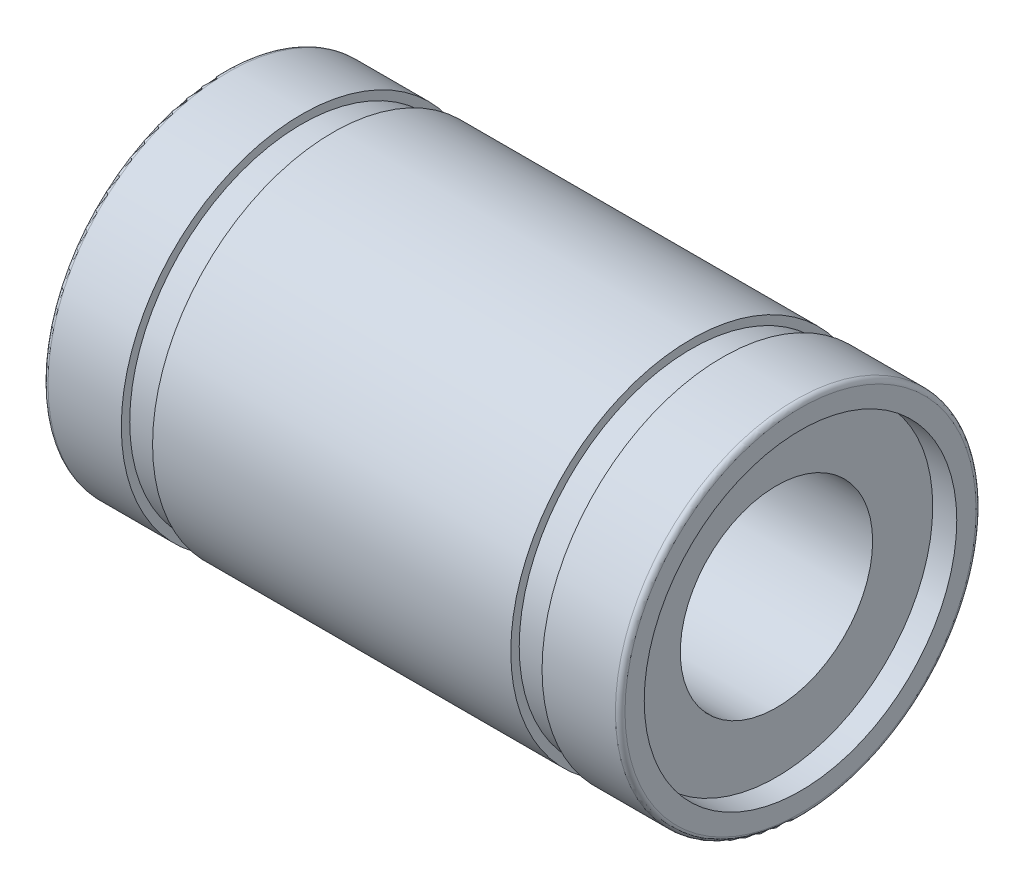
ISO-10303-21;
HEADER;
FILE_DESCRIPTION(('STEP AP214'),'2;1');
FILE_NAME('part.step','',(''),(''),'','','');
FILE_SCHEMA(('AUTOMOTIVE_DESIGN { 1 0 10303 214 1 1 1 1 }'));
ENDSEC;
DATA;
#1=APPLICATION_CONTEXT('core data for automotive mechanical design processes');
#2=APPLICATION_PROTOCOL_DEFINITION('international standard','automotive_design',2000,#1);
#3=PRODUCT_CONTEXT('',#1,'mechanical');
#4=PRODUCT('Part','Part','',(#3));
#5=PRODUCT_RELATED_PRODUCT_CATEGORY('part','',(#4));
#6=PRODUCT_DEFINITION_FORMATION('','',#4);
#7=PRODUCT_DEFINITION_CONTEXT('part definition',#1,'design');
#8=PRODUCT_DEFINITION('design','',#6,#7);
#9=PRODUCT_DEFINITION_SHAPE('','',#8);
#10=(LENGTH_UNIT() NAMED_UNIT(*) SI_UNIT(.MILLI.,.METRE.));
#11=(NAMED_UNIT(*) PLANE_ANGLE_UNIT() SI_UNIT($,.RADIAN.));
#12=(NAMED_UNIT(*) SI_UNIT($,.STERADIAN.) SOLID_ANGLE_UNIT());
#13=UNCERTAINTY_MEASURE_WITH_UNIT(LENGTH_MEASURE(1.E-05),#10,'distance_accuracy_value','');
#14=(GEOMETRIC_REPRESENTATION_CONTEXT(3) GLOBAL_UNCERTAINTY_ASSIGNED_CONTEXT((#13)) GLOBAL_UNIT_ASSIGNED_CONTEXT((#10,
#11,#12)) REPRESENTATION_CONTEXT('',''));
#15=CARTESIAN_POINT('',(0.,0.,0.));
#16=DIRECTION('',(0.,0.,1.));
#17=DIRECTION('',(1.,0.,0.));
#18=AXIS2_PLACEMENT_3D('',#15,#16,#17);
#19=CARTESIAN_POINT('',(-12.,0.,0.));
#20=DIRECTION('',(-1.,0.,0.));
#21=DIRECTION('',(0.,0.,1.));
#22=AXIS2_PLACEMENT_3D('',#19,#20,#21);
#23=CYLINDRICAL_SURFACE('',#22,6.5);
#24=CARTESIAN_POINT('',(-11.,0.,0.));
#25=DIRECTION('',(-1.,0.,0.));
#26=DIRECTION('',(0.,0.,1.));
#27=AXIS2_PLACEMENT_3D('',#24,#25,#26);
#28=CIRCLE('',#27,6.5);
#29=CARTESIAN_POINT('',(-11.,0.,-6.5));
#30=VERTEX_POINT('',#29);
#31=EDGE_CURVE('E34',#30,#30,#28,.T.);
#32=ORIENTED_EDGE('',*,*,#31,.F.);
#33=EDGE_LOOP('',(#32));
#34=FACE_BOUND('',#33,.T.);
#35=CARTESIAN_POINT('',(-12.,0.,0.));
#36=DIRECTION('',(-1.,0.,0.));
#37=DIRECTION('',(0.,0.,1.));
#38=AXIS2_PLACEMENT_3D('',#35,#36,#37);
#39=CIRCLE('',#38,6.5);
#40=CARTESIAN_POINT('',(-12.,0.,-6.5));
#41=VERTEX_POINT('',#40);
#42=EDGE_CURVE('E11',#41,#41,#39,.T.);
#43=ORIENTED_EDGE('',*,*,#42,.T.);
#44=EDGE_LOOP('',(#43));
#45=FACE_BOUND('',#44,.T.);
#46=ADVANCED_FACE('F17',(#34,#45),#23,.F.);
#47=CARTESIAN_POINT('',(-11.,0.,0.));
#48=DIRECTION('',(-1.,0.,0.));
#49=DIRECTION('',(0.,0.707106781186548,0.707106781186548));
#50=AXIS2_PLACEMENT_3D('',#47,#48,#49);
#51=PLANE('',#50);
#52=CARTESIAN_POINT('',(-11.,0.,0.));
#53=DIRECTION('',(1.,0.,0.));
#54=DIRECTION('',(0.,0.,1.));
#55=AXIS2_PLACEMENT_3D('',#52,#53,#54);
#56=CIRCLE('',#55,4.);
#57=CARTESIAN_POINT('',(-11.,0.,-4.));
#58=VERTEX_POINT('',#57);
#59=EDGE_CURVE('E27',#58,#58,#56,.T.);
#60=ORIENTED_EDGE('',*,*,#59,.T.);
#61=EDGE_LOOP('',(#60));
#62=FACE_BOUND('',#61,.T.);
#63=ORIENTED_EDGE('',*,*,#31,.T.);
#64=EDGE_LOOP('',(#63));
#65=FACE_BOUND('',#64,.T.);
#66=ADVANCED_FACE('F137',(#62,#65),#51,.T.);
#67=CARTESIAN_POINT('',(-11.8,0.,0.));
#68=DIRECTION('',(1.,0.,0.));
#69=DIRECTION('',(0.,0.707106781186548,0.707106781186548));
#70=AXIS2_PLACEMENT_3D('',#67,#68,#69);
#71=TOROIDAL_SURFACE('',#70,7.3,0.2);
#72=CARTESIAN_POINT('',(-12.,0.,0.));
#73=DIRECTION('',(-1.,0.,0.));
#74=DIRECTION('',(0.,0.,-1.));
#75=AXIS2_PLACEMENT_3D('',#72,#73,#74);
#76=CIRCLE('',#75,7.3);
#77=CARTESIAN_POINT('',(-12.,0.,7.3));
#78=VERTEX_POINT('',#77);
#79=EDGE_CURVE('E204',#78,#78,#76,.T.);
#80=ORIENTED_EDGE('',*,*,#79,.F.);
#81=EDGE_LOOP('',(#80));
#82=FACE_BOUND('',#81,.T.);
#83=CARTESIAN_POINT('',(-11.8,0.,0.));
#84=DIRECTION('',(1.,0.,0.));
#85=DIRECTION('',(0.,0.,-1.));
#86=AXIS2_PLACEMENT_3D('',#83,#84,#85);
#87=CIRCLE('',#86,7.5);
#88=CARTESIAN_POINT('',(-11.8,0.,7.5));
#89=VERTEX_POINT('',#88);
#90=EDGE_CURVE('E208',#89,#89,#87,.T.);
#91=ORIENTED_EDGE('',*,*,#90,.F.);
#92=EDGE_LOOP('',(#91));
#93=FACE_BOUND('',#92,.T.);
#94=ADVANCED_FACE('F142',(#82,#93),#71,.T.);
#95=CARTESIAN_POINT('',(-10.375,0.,0.));
#96=DIRECTION('',(-1.,0.,0.));
#97=DIRECTION('',(0.,0.,1.));
#98=AXIS2_PLACEMENT_3D('',#95,#96,#97);
#99=CYLINDRICAL_SURFACE('',#98,7.5);
#100=CARTESIAN_POINT('',(-8.75,0.,0.));
#101=DIRECTION('',(-1.,0.,0.));
#102=DIRECTION('',(0.,0.,1.));
#103=AXIS2_PLACEMENT_3D('',#100,#101,#102);
#104=CIRCLE('',#103,7.5);
#105=CARTESIAN_POINT('',(-8.75,0.,7.5));
#106=VERTEX_POINT('',#105);
#107=EDGE_CURVE('E205',#106,#106,#104,.T.);
#108=ORIENTED_EDGE('',*,*,#107,.T.);
#109=EDGE_LOOP('',(#108));
#110=FACE_BOUND('',#109,.T.);
#111=ORIENTED_EDGE('',*,*,#90,.T.);
#112=EDGE_LOOP('',(#111));
#113=FACE_BOUND('',#112,.T.);
#114=ADVANCED_FACE('F149',(#110,#113),#99,.T.);
#115=CARTESIAN_POINT('',(-12.,0.,5.75));
#116=DIRECTION('',(-1.,0.,0.));
#117=DIRECTION('',(0.,0.707106781186548,0.707106781186548));
#118=AXIS2_PLACEMENT_3D('',#115,#116,#117);
#119=PLANE('',#118);
#120=ORIENTED_EDGE('',*,*,#42,.F.);
#121=EDGE_LOOP('',(#120));
#122=FACE_BOUND('',#121,.T.);
#123=ORIENTED_EDGE('',*,*,#79,.T.);
#124=EDGE_LOOP('',(#123));
#125=FACE_BOUND('',#124,.T.);
#126=ADVANCED_FACE('F153',(#122,#125),#119,.T.);
#127=CARTESIAN_POINT('',(-8.75,0.,7.325));
#128=DIRECTION('',(1.,0.,0.));
#129=DIRECTION('',(0.,0.707106781186548,0.707106781186548));
#130=AXIS2_PLACEMENT_3D('',#127,#128,#129);
#131=PLANE('',#130);
#132=CARTESIAN_POINT('',(-8.75,0.,0.));
#133=DIRECTION('',(-1.,0.,0.));
#134=DIRECTION('',(0.,0.,1.));
#135=AXIS2_PLACEMENT_3D('',#132,#133,#134);
#136=CIRCLE('',#135,7.15);
#137=CARTESIAN_POINT('',(-8.75,0.,7.15));
#138=VERTEX_POINT('',#137);
#139=EDGE_CURVE('E199',#138,#138,#136,.T.);
#140=ORIENTED_EDGE('',*,*,#139,.T.);
#141=EDGE_LOOP('',(#140));
#142=FACE_BOUND('',#141,.T.);
#143=ORIENTED_EDGE('',*,*,#107,.F.);
#144=EDGE_LOOP('',(#143));
#145=FACE_BOUND('',#144,.T.);
#146=ADVANCED_FACE('F157',(#142,#145),#131,.T.);
#147=CARTESIAN_POINT('',(-8.1,0.,0.));
#148=DIRECTION('',(-1.,0.,0.));
#149=DIRECTION('',(0.,0.,1.));
#150=AXIS2_PLACEMENT_3D('',#147,#148,#149);
#151=CYLINDRICAL_SURFACE('',#150,7.15);
#152=CARTESIAN_POINT('',(-7.45,0.,0.));
#153=DIRECTION('',(-1.,0.,0.));
#154=DIRECTION('',(0.,0.,1.));
#155=AXIS2_PLACEMENT_3D('',#152,#153,#154);
#156=CIRCLE('',#155,7.15);
#157=CARTESIAN_POINT('',(-7.45,0.,7.15));
#158=VERTEX_POINT('',#157);
#159=EDGE_CURVE('E196',#158,#158,#156,.T.);
#160=ORIENTED_EDGE('',*,*,#159,.T.);
#161=EDGE_LOOP('',(#160));
#162=FACE_BOUND('',#161,.T.);
#163=ORIENTED_EDGE('',*,*,#139,.F.);
#164=EDGE_LOOP('',(#163));
#165=FACE_BOUND('',#164,.T.);
#166=ADVANCED_FACE('F161',(#162,#165),#151,.T.);
#167=CARTESIAN_POINT('',(-7.45,0.,7.325));
#168=DIRECTION('',(-1.,0.,0.));
#169=DIRECTION('',(0.,0.707106781186548,0.707106781186548));
#170=AXIS2_PLACEMENT_3D('',#167,#168,#169);
#171=PLANE('',#170);
#172=CARTESIAN_POINT('',(-7.45,0.,0.));
#173=DIRECTION('',(-1.,0.,0.));
#174=DIRECTION('',(0.,0.,1.));
#175=AXIS2_PLACEMENT_3D('',#172,#173,#174);
#176=CIRCLE('',#175,7.5);
#177=CARTESIAN_POINT('',(-7.45,0.,7.5));
#178=VERTEX_POINT('',#177);
#179=EDGE_CURVE('E195',#178,#178,#176,.T.);
#180=ORIENTED_EDGE('',*,*,#179,.T.);
#181=EDGE_LOOP('',(#180));
#182=FACE_BOUND('',#181,.T.);
#183=ORIENTED_EDGE('',*,*,#159,.F.);
#184=EDGE_LOOP('',(#183));
#185=FACE_BOUND('',#184,.T.);
#186=ADVANCED_FACE('F165',(#182,#185),#171,.T.);
#187=CARTESIAN_POINT('',(12.,0.,0.));
#188=DIRECTION('',(-1.,0.,0.));
#189=DIRECTION('',(0.,0.,1.));
#190=AXIS2_PLACEMENT_3D('',#187,#188,#189);
#191=CYLINDRICAL_SURFACE('',#190,6.5);
#192=CARTESIAN_POINT('',(11.,0.,0.));
#193=DIRECTION('',(-1.,0.,0.));
#194=DIRECTION('',(0.,0.,1.));
#195=AXIS2_PLACEMENT_3D('',#192,#193,#194);
#196=CIRCLE('',#195,6.5);
#197=CARTESIAN_POINT('',(11.,0.,-6.5));
#198=VERTEX_POINT('',#197);
#199=EDGE_CURVE('E102',#198,#198,#196,.T.);
#200=ORIENTED_EDGE('',*,*,#199,.T.);
#201=EDGE_LOOP('',(#200));
#202=FACE_BOUND('',#201,.T.);
#203=CARTESIAN_POINT('',(12.,0.,0.));
#204=DIRECTION('',(-1.,0.,0.));
#205=DIRECTION('',(0.,0.,1.));
#206=AXIS2_PLACEMENT_3D('',#203,#204,#205);
#207=CIRCLE('',#206,6.5);
#208=CARTESIAN_POINT('',(12.,0.,-6.5));
#209=VERTEX_POINT('',#208);
#210=EDGE_CURVE('E97',#209,#209,#207,.T.);
#211=ORIENTED_EDGE('',*,*,#210,.F.);
#212=EDGE_LOOP('',(#211));
#213=FACE_BOUND('',#212,.T.);
#214=ADVANCED_FACE('F133',(#202,#213),#191,.F.);
#215=CARTESIAN_POINT('',(11.,0.,0.));
#216=DIRECTION('',(1.,0.,0.));
#217=DIRECTION('',(0.,0.707106781186548,0.707106781186548));
#218=AXIS2_PLACEMENT_3D('',#215,#216,#217);
#219=PLANE('',#218);
#220=CARTESIAN_POINT('',(11.,0.,0.));
#221=DIRECTION('',(1.,0.,0.));
#222=DIRECTION('',(0.,0.,1.));
#223=AXIS2_PLACEMENT_3D('',#220,#221,#222);
#224=CIRCLE('',#223,4.);
#225=CARTESIAN_POINT('',(11.,0.,-4.));
#226=VERTEX_POINT('',#225);
#227=EDGE_CURVE('E90',#226,#226,#224,.T.);
#228=ORIENTED_EDGE('',*,*,#227,.F.);
#229=EDGE_LOOP('',(#228));
#230=FACE_BOUND('',#229,.T.);
#231=ORIENTED_EDGE('',*,*,#199,.F.);
#232=EDGE_LOOP('',(#231));
#233=FACE_BOUND('',#232,.T.);
#234=ADVANCED_FACE('F126',(#230,#233),#219,.T.);
#235=CARTESIAN_POINT('',(11.8,0.,0.));
#236=DIRECTION('',(-1.,0.,0.));
#237=DIRECTION('',(0.,0.707106781186548,0.707106781186548));
#238=AXIS2_PLACEMENT_3D('',#235,#236,#237);
#239=TOROIDAL_SURFACE('',#238,7.3,0.2);
#240=CARTESIAN_POINT('',(12.,0.,0.));
#241=DIRECTION('',(-1.,0.,0.));
#242=DIRECTION('',(0.,0.,-1.));
#243=AXIS2_PLACEMENT_3D('',#240,#241,#242);
#244=CIRCLE('',#243,7.3);
#245=CARTESIAN_POINT('',(12.,0.,7.3));
#246=VERTEX_POINT('',#245);
#247=EDGE_CURVE('E99',#246,#246,#244,.T.);
#248=ORIENTED_EDGE('',*,*,#247,.T.);
#249=EDGE_LOOP('',(#248));
#250=FACE_BOUND('',#249,.T.);
#251=CARTESIAN_POINT('',(11.8,0.,0.));
#252=DIRECTION('',(1.,0.,0.));
#253=DIRECTION('',(0.,0.,-1.));
#254=AXIS2_PLACEMENT_3D('',#251,#252,#253);
#255=CIRCLE('',#254,7.5);
#256=CARTESIAN_POINT('',(11.8,0.,7.5));
#257=VERTEX_POINT('',#256);
#258=EDGE_CURVE('E103',#257,#257,#255,.T.);
#259=ORIENTED_EDGE('',*,*,#258,.T.);
#260=EDGE_LOOP('',(#259));
#261=FACE_BOUND('',#260,.T.);
#262=ADVANCED_FACE('F122',(#250,#261),#239,.T.);
#263=CARTESIAN_POINT('',(10.375,0.,0.));
#264=DIRECTION('',(-1.,0.,0.));
#265=DIRECTION('',(0.,0.,1.));
#266=AXIS2_PLACEMENT_3D('',#263,#264,#265);
#267=CYLINDRICAL_SURFACE('',#266,7.5);
#268=CARTESIAN_POINT('',(8.75,0.,0.));
#269=DIRECTION('',(-1.,0.,0.));
#270=DIRECTION('',(0.,0.,1.));
#271=AXIS2_PLACEMENT_3D('',#268,#269,#270);
#272=CIRCLE('',#271,7.5);
#273=CARTESIAN_POINT('',(8.75,0.,7.5));
#274=VERTEX_POINT('',#273);
#275=EDGE_CURVE('E106',#274,#274,#272,.T.);
#276=ORIENTED_EDGE('',*,*,#275,.F.);
#277=EDGE_LOOP('',(#276));
#278=FACE_BOUND('',#277,.T.);
#279=ORIENTED_EDGE('',*,*,#258,.F.);
#280=EDGE_LOOP('',(#279));
#281=FACE_BOUND('',#280,.T.);
#282=ADVANCED_FACE('F119',(#278,#281),#267,.T.);
#283=CARTESIAN_POINT('',(12.,0.,5.75));
#284=DIRECTION('',(1.,0.,0.));
#285=DIRECTION('',(0.,0.707106781186548,0.707106781186548));
#286=AXIS2_PLACEMENT_3D('',#283,#284,#285);
#287=PLANE('',#286);
#288=ORIENTED_EDGE('',*,*,#210,.T.);
#289=EDGE_LOOP('',(#288));
#290=FACE_BOUND('',#289,.T.);
#291=ORIENTED_EDGE('',*,*,#247,.F.);
#292=EDGE_LOOP('',(#291));
#293=FACE_BOUND('',#292,.T.);
#294=ADVANCED_FACE('F116',(#290,#293),#287,.T.);
#295=CARTESIAN_POINT('',(8.75,0.,7.325));
#296=DIRECTION('',(-1.,0.,0.));
#297=DIRECTION('',(0.,0.707106781186548,0.707106781186548));
#298=AXIS2_PLACEMENT_3D('',#295,#296,#297);
#299=PLANE('',#298);
#300=CARTESIAN_POINT('',(8.75,0.,0.));
#301=DIRECTION('',(-1.,0.,0.));
#302=DIRECTION('',(0.,0.,1.));
#303=AXIS2_PLACEMENT_3D('',#300,#301,#302);
#304=CIRCLE('',#303,7.15);
#305=CARTESIAN_POINT('',(8.75,0.,7.15));
#306=VERTEX_POINT('',#305);
#307=EDGE_CURVE('E91',#306,#306,#304,.T.);
#308=ORIENTED_EDGE('',*,*,#307,.F.);
#309=EDGE_LOOP('',(#308));
#310=FACE_BOUND('',#309,.T.);
#311=ORIENTED_EDGE('',*,*,#275,.T.);
#312=EDGE_LOOP('',(#311));
#313=FACE_BOUND('',#312,.T.);
#314=ADVANCED_FACE('F113',(#310,#313),#299,.T.);
#315=CARTESIAN_POINT('',(8.1,0.,0.));
#316=DIRECTION('',(-1.,0.,0.));
#317=DIRECTION('',(0.,0.,1.));
#318=AXIS2_PLACEMENT_3D('',#315,#316,#317);
#319=CYLINDRICAL_SURFACE('',#318,7.15);
#320=CARTESIAN_POINT('',(7.45,0.,0.));
#321=DIRECTION('',(-1.,0.,0.));
#322=DIRECTION('',(0.,0.,1.));
#323=AXIS2_PLACEMENT_3D('',#320,#321,#322);
#324=CIRCLE('',#323,7.15);
#325=CARTESIAN_POINT('',(7.45,0.,7.15));
#326=VERTEX_POINT('',#325);
#327=EDGE_CURVE('E83',#326,#326,#324,.T.);
#328=ORIENTED_EDGE('',*,*,#327,.F.);
#329=EDGE_LOOP('',(#328));
#330=FACE_BOUND('',#329,.T.);
#331=ORIENTED_EDGE('',*,*,#307,.T.);
#332=EDGE_LOOP('',(#331));
#333=FACE_BOUND('',#332,.T.);
#334=ADVANCED_FACE('F111',(#330,#333),#319,.T.);
#335=CARTESIAN_POINT('',(7.45,0.,7.325));
#336=DIRECTION('',(1.,0.,0.));
#337=DIRECTION('',(0.,0.707106781186548,0.707106781186548));
#338=AXIS2_PLACEMENT_3D('',#335,#336,#337);
#339=PLANE('',#338);
#340=CARTESIAN_POINT('',(7.45,0.,0.));
#341=DIRECTION('',(-1.,0.,0.));
#342=DIRECTION('',(0.,0.,1.));
#343=AXIS2_PLACEMENT_3D('',#340,#341,#342);
#344=CIRCLE('',#343,7.5);
#345=CARTESIAN_POINT('',(7.45,0.,7.5));
#346=VERTEX_POINT('',#345);
#347=EDGE_CURVE('E21',#346,#346,#344,.T.);
#348=ORIENTED_EDGE('',*,*,#347,.F.);
#349=EDGE_LOOP('',(#348));
#350=FACE_BOUND('',#349,.T.);
#351=ORIENTED_EDGE('',*,*,#327,.T.);
#352=EDGE_LOOP('',(#351));
#353=FACE_BOUND('',#352,.T.);
#354=ADVANCED_FACE('F87',(#350,#353),#339,.T.);
#355=CARTESIAN_POINT('',(3.725,0.,0.));
#356=DIRECTION('',(-1.,0.,0.));
#357=DIRECTION('',(0.,0.,1.));
#358=AXIS2_PLACEMENT_3D('',#355,#356,#357);
#359=CYLINDRICAL_SURFACE('',#358,7.5);
#360=ORIENTED_EDGE('',*,*,#179,.F.);
#361=EDGE_LOOP('',(#360));
#362=FACE_BOUND('',#361,.T.);
#363=ORIENTED_EDGE('',*,*,#347,.T.);
#364=EDGE_LOOP('',(#363));
#365=FACE_BOUND('',#364,.T.);
#366=ADVANCED_FACE('F187',(#362,#365),#359,.T.);
#367=CARTESIAN_POINT('',(6.,0.,0.));
#368=DIRECTION('',(1.,0.,0.));
#369=DIRECTION('',(0.,0.,1.));
#370=AXIS2_PLACEMENT_3D('',#367,#368,#369);
#371=CYLINDRICAL_SURFACE('',#370,4.);
#372=ORIENTED_EDGE('',*,*,#59,.F.);
#373=EDGE_LOOP('',(#372));
#374=FACE_BOUND('',#373,.T.);
#375=ORIENTED_EDGE('',*,*,#227,.T.);
#376=EDGE_LOOP('',(#375));
#377=FACE_BOUND('',#376,.T.);
#378=ADVANCED_FACE('F19',(#374,#377),#371,.F.);
#379=CLOSED_SHELL('',(#46,#66,#94,#114,#126,#146,#166,#186,#214,#234,#262,#282,#294,#314,#334,
#354,#366,#378));
#380=MANIFOLD_SOLID_BREP('B1',#379);
#381=ADVANCED_BREP_SHAPE_REPRESENTATION('',(#18,#380),#14);
#382=SHAPE_DEFINITION_REPRESENTATION(#9,#381);
ENDSEC;
END-ISO-10303-21;
